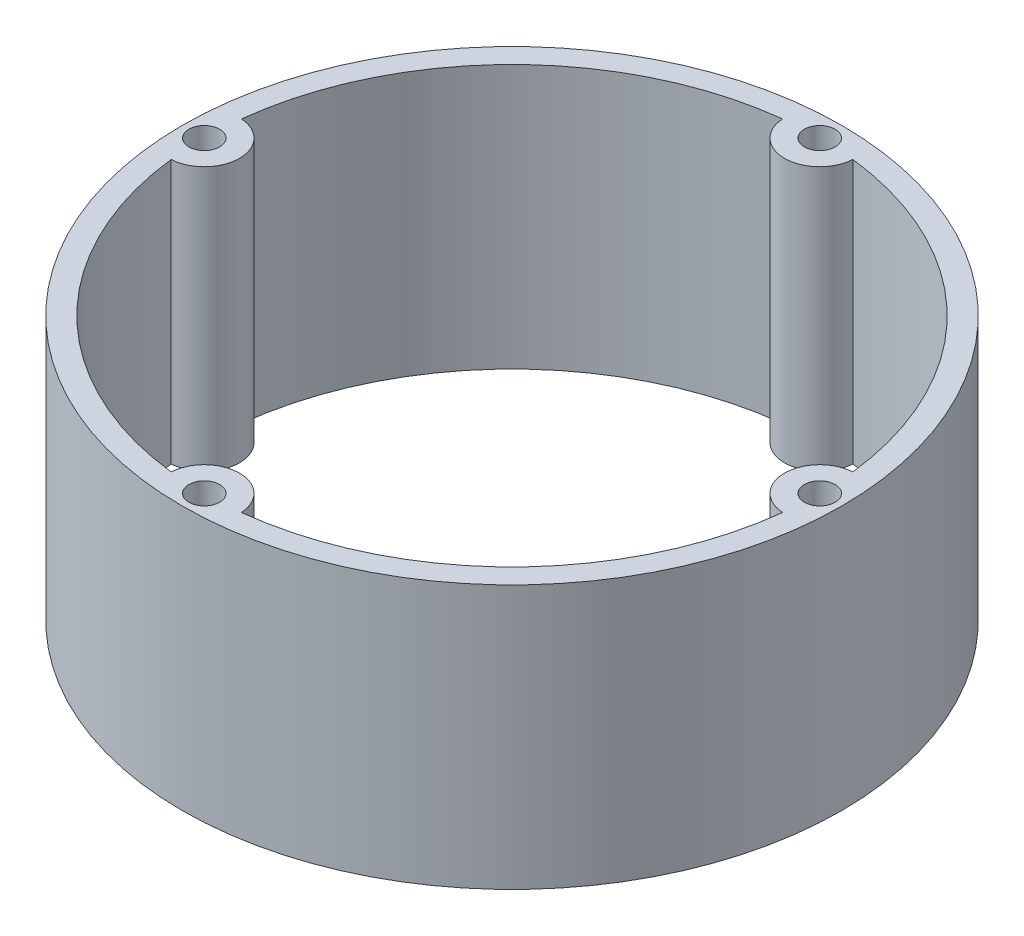
ISO-10303-21;
HEADER;
FILE_DESCRIPTION(('STEP AP214'),'2;1');
FILE_NAME('part.step','',(''),(''),'','','');
FILE_SCHEMA(('AUTOMOTIVE_DESIGN { 1 0 10303 214 1 1 1 1 }'));
ENDSEC;
DATA;
#1=APPLICATION_CONTEXT('core data for automotive mechanical design processes');
#2=APPLICATION_PROTOCOL_DEFINITION('international standard','automotive_design',2000,#1);
#3=PRODUCT_CONTEXT('',#1,'mechanical');
#4=PRODUCT('Part','Part','',(#3));
#5=PRODUCT_RELATED_PRODUCT_CATEGORY('part','',(#4));
#6=PRODUCT_DEFINITION_FORMATION('','',#4);
#7=PRODUCT_DEFINITION_CONTEXT('part definition',#1,'design');
#8=PRODUCT_DEFINITION('design','',#6,#7);
#9=PRODUCT_DEFINITION_SHAPE('','',#8);
#10=(LENGTH_UNIT() NAMED_UNIT(*) SI_UNIT(.MILLI.,.METRE.));
#11=(NAMED_UNIT(*) PLANE_ANGLE_UNIT() SI_UNIT($,.RADIAN.));
#12=(NAMED_UNIT(*) SI_UNIT($,.STERADIAN.) SOLID_ANGLE_UNIT());
#13=UNCERTAINTY_MEASURE_WITH_UNIT(LENGTH_MEASURE(1.E-05),#10,'distance_accuracy_value','');
#14=(GEOMETRIC_REPRESENTATION_CONTEXT(3) GLOBAL_UNCERTAINTY_ASSIGNED_CONTEXT((#13)) GLOBAL_UNIT_ASSIGNED_CONTEXT((#10,
#11,#12)) REPRESENTATION_CONTEXT('',''));
#15=CARTESIAN_POINT('',(0.,0.,0.));
#16=DIRECTION('',(0.,0.,1.));
#17=DIRECTION('',(1.,0.,0.));
#18=AXIS2_PLACEMENT_3D('',#15,#16,#17);
#19=CARTESIAN_POINT('',(0.,30.,0.));
#20=DIRECTION('',(0.,1.,0.));
#21=DIRECTION('',(0.,0.,1.));
#22=AXIS2_PLACEMENT_3D('',#19,#20,#21);
#23=PLANE('',#22);
#24=CARTESIAN_POINT('',(1.97666086873724E-12,30.,35.0000000000022));
#25=DIRECTION('',(0.,1.,0.));
#26=DIRECTION('',(0.,0.,1.));
#27=AXIS2_PLACEMENT_3D('',#24,#25,#26);
#28=CIRCLE('',#27,1.75000000000148);
#29=CARTESIAN_POINT('',(1.97666086873724E-12,30.,36.7500000000037));
#30=VERTEX_POINT('',#29);
#31=EDGE_CURVE('E193',#30,#30,#28,.T.);
#32=ORIENTED_EDGE('',*,*,#31,.F.);
#33=EDGE_LOOP('',(#32));
#34=FACE_BOUND('',#33,.T.);
#35=CARTESIAN_POINT('',(0.,30.,0.));
#36=DIRECTION('',(0.,1.,0.));
#37=DIRECTION('',(0.,0.,1.));
#38=AXIS2_PLACEMENT_3D('',#35,#36,#37);
#39=CIRCLE('',#38,35.);
#40=CARTESIAN_POINT('',(-34.7714285714283,30.,3.99346404792343));
#41=VERTEX_POINT('',#40);
#42=CARTESIAN_POINT('',(-3.99346404791928,30.,34.7714285714288));
#43=VERTEX_POINT('',#42);
#44=EDGE_CURVE('E106',#41,#43,#39,.T.);
#45=ORIENTED_EDGE('',*,*,#44,.F.);
#46=CARTESIAN_POINT('',(-35.0000000000001,30.,2.08896193498298E-12));
#47=DIRECTION('',(0.,-1.,0.));
#48=DIRECTION('',(0.,0.,1.));
#49=AXIS2_PLACEMENT_3D('',#46,#47,#48);
#50=CIRCLE('',#49,3.99999999999996);
#51=CARTESIAN_POINT('',(-34.7714285714288,30.,-3.99346404791928));
#52=VERTEX_POINT('',#51);
#53=EDGE_CURVE('E98',#52,#41,#50,.T.);
#54=ORIENTED_EDGE('',*,*,#53,.F.);
#55=CARTESIAN_POINT('',(0.,30.,0.));
#56=DIRECTION('',(0.,1.,0.));
#57=DIRECTION('',(0.,0.,1.));
#58=AXIS2_PLACEMENT_3D('',#55,#56,#57);
#59=CIRCLE('',#58,35.);
#60=CARTESIAN_POINT('',(-3.99346404792344,30.,-34.7714285714283));
#61=VERTEX_POINT('',#60);
#62=EDGE_CURVE('E133',#61,#52,#59,.T.);
#63=ORIENTED_EDGE('',*,*,#62,.F.);
#64=CARTESIAN_POINT('',(-2.09110506688148E-12,30.,-35.0000000000001));
#65=DIRECTION('',(0.,-1.,0.));
#66=DIRECTION('',(0.,0.,1.));
#67=AXIS2_PLACEMENT_3D('',#64,#65,#66);
#68=CIRCLE('',#67,3.99999999999996);
#69=CARTESIAN_POINT('',(3.99346404791929,30.,-34.7714285714288));
#70=VERTEX_POINT('',#69);
#71=EDGE_CURVE('E131',#70,#61,#68,.T.);
#72=ORIENTED_EDGE('',*,*,#71,.F.);
#73=CARTESIAN_POINT('',(0.,30.,0.));
#74=DIRECTION('',(0.,1.,0.));
#75=DIRECTION('',(0.,0.,1.));
#76=AXIS2_PLACEMENT_3D('',#73,#74,#75);
#77=CIRCLE('',#76,35.);
#78=CARTESIAN_POINT('',(34.7714285714283,30.,-3.99346404792344));
#79=VERTEX_POINT('',#78);
#80=EDGE_CURVE('E129',#79,#70,#77,.T.);
#81=ORIENTED_EDGE('',*,*,#80,.F.);
#82=CARTESIAN_POINT('',(35.0000000000001,30.,-2.09324819877999E-12));
#83=DIRECTION('',(0.,-1.,0.));
#84=DIRECTION('',(0.,0.,1.));
#85=AXIS2_PLACEMENT_3D('',#82,#83,#84);
#86=CIRCLE('',#85,3.99999999999996);
#87=CARTESIAN_POINT('',(34.7714285714288,30.,3.99346404791928));
#88=VERTEX_POINT('',#87);
#89=EDGE_CURVE('E127',#88,#79,#86,.T.);
#90=ORIENTED_EDGE('',*,*,#89,.F.);
#91=CARTESIAN_POINT('',(0.,30.,0.));
#92=DIRECTION('',(0.,1.,0.));
#93=DIRECTION('',(0.,0.,1.));
#94=AXIS2_PLACEMENT_3D('',#91,#92,#93);
#95=CIRCLE('',#94,35.);
#96=CARTESIAN_POINT('',(3.99346404792345,30.,34.7714285714283));
#97=VERTEX_POINT('',#96);
#98=EDGE_CURVE('E122',#97,#88,#95,.T.);
#99=ORIENTED_EDGE('',*,*,#98,.F.);
#100=CARTESIAN_POINT('',(2.0953913306785E-12,30.,35.0000000000001));
#101=DIRECTION('',(0.,-1.,0.));
#102=DIRECTION('',(0.,0.,1.));
#103=AXIS2_PLACEMENT_3D('',#100,#101,#102);
#104=CIRCLE('',#103,3.99999999999996);
#105=EDGE_CURVE('E120',#43,#97,#104,.T.);
#106=ORIENTED_EDGE('',*,*,#105,.F.);
#107=EDGE_LOOP('',(#45,#54,#63,#72,#81,#90,#99,#106));
#108=FACE_BOUND('',#107,.T.);
#109=CARTESIAN_POINT('',(0.,30.,-35.));
#110=DIRECTION('',(0.,1.,0.));
#111=DIRECTION('',(0.,0.,1.));
#112=AXIS2_PLACEMENT_3D('',#109,#110,#111);
#113=CIRCLE('',#112,1.75);
#114=CARTESIAN_POINT('',(0.,30.,-33.25));
#115=VERTEX_POINT('',#114);
#116=EDGE_CURVE('E166',#115,#115,#113,.T.);
#117=ORIENTED_EDGE('',*,*,#116,.F.);
#118=EDGE_LOOP('',(#117));
#119=FACE_BOUND('',#118,.T.);
#120=CARTESIAN_POINT('',(0.,30.,0.));
#121=DIRECTION('',(0.,1.,0.));
#122=DIRECTION('',(0.,0.,1.));
#123=AXIS2_PLACEMENT_3D('',#120,#121,#122);
#124=CIRCLE('',#123,37.5);
#125=CARTESIAN_POINT('',(0.,30.,37.5));
#126=VERTEX_POINT('',#125);
#127=EDGE_CURVE('E11',#126,#126,#124,.T.);
#128=ORIENTED_EDGE('',*,*,#127,.T.);
#129=EDGE_LOOP('',(#128));
#130=FACE_BOUND('',#129,.T.);
#131=CARTESIAN_POINT('',(35.0000000000021,30.,1.08014802448722E-13));
#132=DIRECTION('',(0.,1.,0.));
#133=DIRECTION('',(0.,0.,1.));
#134=AXIS2_PLACEMENT_3D('',#131,#132,#133);
#135=CIRCLE('',#134,1.7499999999994);
#136=CARTESIAN_POINT('',(35.0000000000021,30.,1.74999999999951));
#137=VERTEX_POINT('',#136);
#138=EDGE_CURVE('E136',#137,#137,#135,.T.);
#139=ORIENTED_EDGE('',*,*,#138,.F.);
#140=EDGE_LOOP('',(#139));
#141=FACE_BOUND('',#140,.T.);
#142=CARTESIAN_POINT('',(-35.0000000000001,30.,2.08896193498298E-12));
#143=DIRECTION('',(0.,1.,0.));
#144=DIRECTION('',(0.,0.,1.));
#145=AXIS2_PLACEMENT_3D('',#142,#143,#144);
#146=CIRCLE('',#145,1.75000000000232);
#147=CARTESIAN_POINT('',(-35.0000000000001,30.,1.75000000000441));
#148=VERTEX_POINT('',#147);
#149=EDGE_CURVE('E200',#148,#148,#146,.T.);
#150=ORIENTED_EDGE('',*,*,#149,.F.);
#151=EDGE_LOOP('',(#150));
#152=FACE_BOUND('',#151,.T.);
#153=ADVANCED_FACE('F33',(#34,#108,#119,#130,#141,#152),#23,.T.);
#154=CARTESIAN_POINT('',(0.,0.,0.));
#155=DIRECTION('',(0.,1.,0.));
#156=DIRECTION('',(0.,0.,1.));
#157=AXIS2_PLACEMENT_3D('',#154,#155,#156);
#158=PLANE('',#157);
#159=CARTESIAN_POINT('',(0.,0.,-35.));
#160=DIRECTION('',(0.,1.,0.));
#161=DIRECTION('',(0.,0.,1.));
#162=AXIS2_PLACEMENT_3D('',#159,#160,#161);
#163=CIRCLE('',#162,1.75);
#164=CARTESIAN_POINT('',(0.,0.,-33.25));
#165=VERTEX_POINT('',#164);
#166=EDGE_CURVE('E114',#165,#165,#163,.T.);
#167=ORIENTED_EDGE('',*,*,#166,.T.);
#168=EDGE_LOOP('',(#167));
#169=FACE_BOUND('',#168,.T.);
#170=CARTESIAN_POINT('',(0.,0.,0.));
#171=DIRECTION('',(0.,1.,0.));
#172=DIRECTION('',(0.,0.,1.));
#173=AXIS2_PLACEMENT_3D('',#170,#171,#172);
#174=CIRCLE('',#173,37.5);
#175=CARTESIAN_POINT('',(0.,0.,37.5));
#176=VERTEX_POINT('',#175);
#177=EDGE_CURVE('E37',#176,#176,#174,.T.);
#178=ORIENTED_EDGE('',*,*,#177,.F.);
#179=EDGE_LOOP('',(#178));
#180=FACE_BOUND('',#179,.T.);
#181=CARTESIAN_POINT('',(-35.0000000000001,0.,2.08896193498298E-12));
#182=DIRECTION('',(0.,-1.,0.));
#183=DIRECTION('',(0.,0.,1.));
#184=AXIS2_PLACEMENT_3D('',#181,#182,#183);
#185=CIRCLE('',#184,3.99999999999996);
#186=CARTESIAN_POINT('',(-34.7714285714288,0.,-3.99346404791928));
#187=VERTEX_POINT('',#186);
#188=CARTESIAN_POINT('',(-34.7714285714283,0.,3.99346404792343));
#189=VERTEX_POINT('',#188);
#190=EDGE_CURVE('E56',#187,#189,#185,.T.);
#191=ORIENTED_EDGE('',*,*,#190,.T.);
#192=CARTESIAN_POINT('',(0.,0.,0.));
#193=DIRECTION('',(0.,1.,0.));
#194=DIRECTION('',(0.,0.,1.));
#195=AXIS2_PLACEMENT_3D('',#192,#193,#194);
#196=CIRCLE('',#195,35.);
#197=CARTESIAN_POINT('',(-3.99346404791928,0.,34.7714285714288));
#198=VERTEX_POINT('',#197);
#199=EDGE_CURVE('E113',#189,#198,#196,.T.);
#200=ORIENTED_EDGE('',*,*,#199,.T.);
#201=CARTESIAN_POINT('',(2.0953913306785E-12,0.,35.0000000000001));
#202=DIRECTION('',(0.,-1.,0.));
#203=DIRECTION('',(0.,0.,1.));
#204=AXIS2_PLACEMENT_3D('',#201,#202,#203);
#205=CIRCLE('',#204,3.99999999999996);
#206=CARTESIAN_POINT('',(3.99346404792345,0.,34.7714285714283));
#207=VERTEX_POINT('',#206);
#208=EDGE_CURVE('E138',#198,#207,#205,.T.);
#209=ORIENTED_EDGE('',*,*,#208,.T.);
#210=CARTESIAN_POINT('',(0.,0.,0.));
#211=DIRECTION('',(0.,1.,0.));
#212=DIRECTION('',(0.,0.,1.));
#213=AXIS2_PLACEMENT_3D('',#210,#211,#212);
#214=CIRCLE('',#213,35.);
#215=CARTESIAN_POINT('',(34.7714285714288,0.,3.99346404791928));
#216=VERTEX_POINT('',#215);
#217=EDGE_CURVE('E141',#207,#216,#214,.T.);
#218=ORIENTED_EDGE('',*,*,#217,.T.);
#219=CARTESIAN_POINT('',(35.0000000000001,0.,-2.09324819877999E-12));
#220=DIRECTION('',(0.,-1.,0.));
#221=DIRECTION('',(0.,0.,1.));
#222=AXIS2_PLACEMENT_3D('',#219,#220,#221);
#223=CIRCLE('',#222,3.99999999999996);
#224=CARTESIAN_POINT('',(34.7714285714283,0.,-3.99346404792344));
#225=VERTEX_POINT('',#224);
#226=EDGE_CURVE('E144',#216,#225,#223,.T.);
#227=ORIENTED_EDGE('',*,*,#226,.T.);
#228=CARTESIAN_POINT('',(0.,0.,0.));
#229=DIRECTION('',(0.,1.,0.));
#230=DIRECTION('',(0.,0.,1.));
#231=AXIS2_PLACEMENT_3D('',#228,#229,#230);
#232=CIRCLE('',#231,35.);
#233=CARTESIAN_POINT('',(3.99346404791929,0.,-34.7714285714288));
#234=VERTEX_POINT('',#233);
#235=EDGE_CURVE('E147',#225,#234,#232,.T.);
#236=ORIENTED_EDGE('',*,*,#235,.T.);
#237=CARTESIAN_POINT('',(-2.09110506688148E-12,0.,-35.0000000000001));
#238=DIRECTION('',(0.,-1.,0.));
#239=DIRECTION('',(0.,0.,1.));
#240=AXIS2_PLACEMENT_3D('',#237,#238,#239);
#241=CIRCLE('',#240,3.99999999999996);
#242=CARTESIAN_POINT('',(-3.99346404792344,0.,-34.7714285714283));
#243=VERTEX_POINT('',#242);
#244=EDGE_CURVE('E150',#234,#243,#241,.T.);
#245=ORIENTED_EDGE('',*,*,#244,.T.);
#246=CARTESIAN_POINT('',(0.,0.,0.));
#247=DIRECTION('',(0.,1.,0.));
#248=DIRECTION('',(0.,0.,1.));
#249=AXIS2_PLACEMENT_3D('',#246,#247,#248);
#250=CIRCLE('',#249,35.);
#251=EDGE_CURVE('E107',#243,#187,#250,.T.);
#252=ORIENTED_EDGE('',*,*,#251,.T.);
#253=EDGE_LOOP('',(#191,#200,#209,#218,#227,#236,#245,#252));
#254=FACE_BOUND('',#253,.T.);
#255=CARTESIAN_POINT('',(35.0000000000021,0.,1.08014802448722E-13));
#256=DIRECTION('',(0.,1.,0.));
#257=DIRECTION('',(0.,0.,1.));
#258=AXIS2_PLACEMENT_3D('',#255,#256,#257);
#259=CIRCLE('',#258,1.7499999999994);
#260=CARTESIAN_POINT('',(35.0000000000021,0.,1.74999999999951));
#261=VERTEX_POINT('',#260);
#262=EDGE_CURVE('E195',#261,#261,#259,.T.);
#263=ORIENTED_EDGE('',*,*,#262,.T.);
#264=EDGE_LOOP('',(#263));
#265=FACE_BOUND('',#264,.T.);
#266=CARTESIAN_POINT('',(1.97666086873724E-12,0.,35.0000000000022));
#267=DIRECTION('',(0.,1.,0.));
#268=DIRECTION('',(0.,0.,1.));
#269=AXIS2_PLACEMENT_3D('',#266,#267,#268);
#270=CIRCLE('',#269,1.75000000000148);
#271=CARTESIAN_POINT('',(1.97666086873724E-12,0.,36.7500000000037));
#272=VERTEX_POINT('',#271);
#273=EDGE_CURVE('E196',#272,#272,#270,.T.);
#274=ORIENTED_EDGE('',*,*,#273,.T.);
#275=EDGE_LOOP('',(#274));
#276=FACE_BOUND('',#275,.T.);
#277=CARTESIAN_POINT('',(-35.0000000000001,0.,2.08896193498298E-12));
#278=DIRECTION('',(0.,1.,0.));
#279=DIRECTION('',(0.,0.,1.));
#280=AXIS2_PLACEMENT_3D('',#277,#278,#279);
#281=CIRCLE('',#280,1.75000000000232);
#282=CARTESIAN_POINT('',(-35.0000000000001,0.,1.75000000000441));
#283=VERTEX_POINT('',#282);
#284=EDGE_CURVE('E203',#283,#283,#281,.T.);
#285=ORIENTED_EDGE('',*,*,#284,.T.);
#286=EDGE_LOOP('',(#285));
#287=FACE_BOUND('',#286,.T.);
#288=ADVANCED_FACE('F172',(#169,#180,#254,#265,#276,#287),#158,.F.);
#289=CARTESIAN_POINT('',(0.,30.,0.));
#290=DIRECTION('',(0.,-1.,0.));
#291=DIRECTION('',(0.,0.,-1.));
#292=AXIS2_PLACEMENT_3D('',#289,#290,#291);
#293=CYLINDRICAL_SURFACE('',#292,37.5);
#294=ORIENTED_EDGE('',*,*,#127,.F.);
#295=EDGE_LOOP('',(#294));
#296=FACE_BOUND('',#295,.T.);
#297=ORIENTED_EDGE('',*,*,#177,.T.);
#298=EDGE_LOOP('',(#297));
#299=FACE_BOUND('',#298,.T.);
#300=ADVANCED_FACE('F35',(#296,#299),#293,.T.);
#301=CARTESIAN_POINT('',(0.,30.,-35.));
#302=DIRECTION('',(0.,-1.,0.));
#303=DIRECTION('',(0.,0.,-1.));
#304=AXIS2_PLACEMENT_3D('',#301,#302,#303);
#305=CYLINDRICAL_SURFACE('',#304,1.75);
#306=ORIENTED_EDGE('',*,*,#116,.T.);
#307=EDGE_LOOP('',(#306));
#308=FACE_BOUND('',#307,.T.);
#309=ORIENTED_EDGE('',*,*,#166,.F.);
#310=EDGE_LOOP('',(#309));
#311=FACE_BOUND('',#310,.T.);
#312=ADVANCED_FACE('F175',(#308,#311),#305,.F.);
#313=CARTESIAN_POINT('',(-35.0000000000001,30.,2.08896193498298E-12));
#314=DIRECTION('',(0.,-1.,0.));
#315=DIRECTION('',(0.,0.,-1.));
#316=AXIS2_PLACEMENT_3D('',#313,#314,#315);
#317=CYLINDRICAL_SURFACE('',#316,3.99999999999996);
#318=ORIENTED_EDGE('',*,*,#190,.F.);
#319=DIRECTION('',(0.,-1.,0.));
#320=VECTOR('',#319,1.);
#321=CARTESIAN_POINT('',(-34.7714285714288,30.,-3.99346404791928));
#322=LINE('',#321,#320);
#323=EDGE_CURVE('E102',#52,#187,#322,.T.);
#324=ORIENTED_EDGE('',*,*,#323,.F.);
#325=ORIENTED_EDGE('',*,*,#53,.T.);
#326=DIRECTION('',(0.,-1.,0.));
#327=VECTOR('',#326,1.);
#328=CARTESIAN_POINT('',(-34.7714285714283,30.,3.99346404792343));
#329=LINE('',#328,#327);
#330=EDGE_CURVE('E101',#41,#189,#329,.T.);
#331=ORIENTED_EDGE('',*,*,#330,.T.);
#332=EDGE_LOOP('',(#318,#324,#325,#331));
#333=FACE_BOUND('',#332,.T.);
#334=ADVANCED_FACE('F100',(#333),#317,.T.);
#335=CARTESIAN_POINT('',(0.,30.,0.));
#336=DIRECTION('',(0.,-1.,0.));
#337=DIRECTION('',(0.,0.,-1.));
#338=AXIS2_PLACEMENT_3D('',#335,#336,#337);
#339=CYLINDRICAL_SURFACE('',#338,35.);
#340=ORIENTED_EDGE('',*,*,#199,.F.);
#341=ORIENTED_EDGE('',*,*,#330,.F.);
#342=ORIENTED_EDGE('',*,*,#44,.T.);
#343=DIRECTION('',(0.,-1.,0.));
#344=VECTOR('',#343,1.);
#345=CARTESIAN_POINT('',(-3.99346404791928,30.,34.7714285714288));
#346=LINE('',#345,#344);
#347=EDGE_CURVE('E115',#43,#198,#346,.T.);
#348=ORIENTED_EDGE('',*,*,#347,.T.);
#349=EDGE_LOOP('',(#340,#341,#342,#348));
#350=FACE_BOUND('',#349,.T.);
#351=ADVANCED_FACE('F110',(#350),#339,.F.);
#352=CARTESIAN_POINT('',(2.0953913306785E-12,30.,35.0000000000001));
#353=DIRECTION('',(0.,-1.,0.));
#354=DIRECTION('',(0.,0.,-1.));
#355=AXIS2_PLACEMENT_3D('',#352,#353,#354);
#356=CYLINDRICAL_SURFACE('',#355,3.99999999999996);
#357=ORIENTED_EDGE('',*,*,#208,.F.);
#358=ORIENTED_EDGE('',*,*,#347,.F.);
#359=ORIENTED_EDGE('',*,*,#105,.T.);
#360=DIRECTION('',(0.,-1.,0.));
#361=VECTOR('',#360,1.);
#362=CARTESIAN_POINT('',(3.99346404792345,30.,34.7714285714283));
#363=LINE('',#362,#361);
#364=EDGE_CURVE('E163',#97,#207,#363,.T.);
#365=ORIENTED_EDGE('',*,*,#364,.T.);
#366=EDGE_LOOP('',(#357,#358,#359,#365));
#367=FACE_BOUND('',#366,.T.);
#368=ADVANCED_FACE('F249',(#367),#356,.T.);
#369=CARTESIAN_POINT('',(0.,30.,0.));
#370=DIRECTION('',(0.,-1.,0.));
#371=DIRECTION('',(0.,0.,-1.));
#372=AXIS2_PLACEMENT_3D('',#369,#370,#371);
#373=CYLINDRICAL_SURFACE('',#372,35.);
#374=ORIENTED_EDGE('',*,*,#217,.F.);
#375=ORIENTED_EDGE('',*,*,#364,.F.);
#376=ORIENTED_EDGE('',*,*,#98,.T.);
#377=DIRECTION('',(0.,-1.,0.));
#378=VECTOR('',#377,1.);
#379=CARTESIAN_POINT('',(34.7714285714288,30.,3.99346404791928));
#380=LINE('',#379,#378);
#381=EDGE_CURVE('E161',#88,#216,#380,.T.);
#382=ORIENTED_EDGE('',*,*,#381,.T.);
#383=EDGE_LOOP('',(#374,#375,#376,#382));
#384=FACE_BOUND('',#383,.T.);
#385=ADVANCED_FACE('F245',(#384),#373,.F.);
#386=CARTESIAN_POINT('',(35.0000000000001,30.,-2.09324819877999E-12));
#387=DIRECTION('',(0.,-1.,0.));
#388=DIRECTION('',(0.,0.,-1.));
#389=AXIS2_PLACEMENT_3D('',#386,#387,#388);
#390=CYLINDRICAL_SURFACE('',#389,3.99999999999996);
#391=ORIENTED_EDGE('',*,*,#226,.F.);
#392=ORIENTED_EDGE('',*,*,#381,.F.);
#393=ORIENTED_EDGE('',*,*,#89,.T.);
#394=DIRECTION('',(0.,-1.,0.));
#395=VECTOR('',#394,1.);
#396=CARTESIAN_POINT('',(34.7714285714283,30.,-3.99346404792344));
#397=LINE('',#396,#395);
#398=EDGE_CURVE('E159',#79,#225,#397,.T.);
#399=ORIENTED_EDGE('',*,*,#398,.T.);
#400=EDGE_LOOP('',(#391,#392,#393,#399));
#401=FACE_BOUND('',#400,.T.);
#402=ADVANCED_FACE('F241',(#401),#390,.T.);
#403=CARTESIAN_POINT('',(0.,30.,0.));
#404=DIRECTION('',(0.,-1.,0.));
#405=DIRECTION('',(0.,0.,-1.));
#406=AXIS2_PLACEMENT_3D('',#403,#404,#405);
#407=CYLINDRICAL_SURFACE('',#406,35.);
#408=ORIENTED_EDGE('',*,*,#235,.F.);
#409=ORIENTED_EDGE('',*,*,#398,.F.);
#410=ORIENTED_EDGE('',*,*,#80,.T.);
#411=DIRECTION('',(0.,-1.,0.));
#412=VECTOR('',#411,1.);
#413=CARTESIAN_POINT('',(3.99346404791929,30.,-34.7714285714288));
#414=LINE('',#413,#412);
#415=EDGE_CURVE('E157',#70,#234,#414,.T.);
#416=ORIENTED_EDGE('',*,*,#415,.T.);
#417=EDGE_LOOP('',(#408,#409,#410,#416));
#418=FACE_BOUND('',#417,.T.);
#419=ADVANCED_FACE('F237',(#418),#407,.F.);
#420=CARTESIAN_POINT('',(-2.09110506688148E-12,30.,-35.0000000000001));
#421=DIRECTION('',(0.,-1.,0.));
#422=DIRECTION('',(0.,0.,-1.));
#423=AXIS2_PLACEMENT_3D('',#420,#421,#422);
#424=CYLINDRICAL_SURFACE('',#423,3.99999999999996);
#425=ORIENTED_EDGE('',*,*,#244,.F.);
#426=ORIENTED_EDGE('',*,*,#415,.F.);
#427=ORIENTED_EDGE('',*,*,#71,.T.);
#428=DIRECTION('',(0.,-1.,0.));
#429=VECTOR('',#428,1.);
#430=CARTESIAN_POINT('',(-3.99346404792344,30.,-34.7714285714283));
#431=LINE('',#430,#429);
#432=EDGE_CURVE('E48',#61,#243,#431,.T.);
#433=ORIENTED_EDGE('',*,*,#432,.T.);
#434=EDGE_LOOP('',(#425,#426,#427,#433));
#435=FACE_BOUND('',#434,.T.);
#436=ADVANCED_FACE('F234',(#435),#424,.T.);
#437=CARTESIAN_POINT('',(0.,30.,0.));
#438=DIRECTION('',(0.,-1.,0.));
#439=DIRECTION('',(0.,0.,-1.));
#440=AXIS2_PLACEMENT_3D('',#437,#438,#439);
#441=CYLINDRICAL_SURFACE('',#440,35.);
#442=ORIENTED_EDGE('',*,*,#251,.F.);
#443=ORIENTED_EDGE('',*,*,#432,.F.);
#444=ORIENTED_EDGE('',*,*,#62,.T.);
#445=ORIENTED_EDGE('',*,*,#323,.T.);
#446=EDGE_LOOP('',(#442,#443,#444,#445));
#447=FACE_BOUND('',#446,.T.);
#448=ADVANCED_FACE('F231',(#447),#441,.F.);
#449=CARTESIAN_POINT('',(35.0000000000021,30.,1.08014802448722E-13));
#450=DIRECTION('',(0.,-1.,0.));
#451=DIRECTION('',(0.,0.,-1.));
#452=AXIS2_PLACEMENT_3D('',#449,#450,#451);
#453=CYLINDRICAL_SURFACE('',#452,1.7499999999994);
#454=ORIENTED_EDGE('',*,*,#138,.T.);
#455=EDGE_LOOP('',(#454));
#456=FACE_BOUND('',#455,.T.);
#457=ORIENTED_EDGE('',*,*,#262,.F.);
#458=EDGE_LOOP('',(#457));
#459=FACE_BOUND('',#458,.T.);
#460=ADVANCED_FACE('F209',(#456,#459),#453,.F.);
#461=CARTESIAN_POINT('',(1.97666086873724E-12,30.,35.0000000000022));
#462=DIRECTION('',(0.,-1.,0.));
#463=DIRECTION('',(0.,0.,-1.));
#464=AXIS2_PLACEMENT_3D('',#461,#462,#463);
#465=CYLINDRICAL_SURFACE('',#464,1.75000000000148);
#466=ORIENTED_EDGE('',*,*,#31,.T.);
#467=EDGE_LOOP('',(#466));
#468=FACE_BOUND('',#467,.T.);
#469=ORIENTED_EDGE('',*,*,#273,.F.);
#470=EDGE_LOOP('',(#469));
#471=FACE_BOUND('',#470,.T.);
#472=ADVANCED_FACE('F222',(#468,#471),#465,.F.);
#473=CARTESIAN_POINT('',(-35.0000000000001,30.,2.08896193498298E-12));
#474=DIRECTION('',(0.,-1.,0.));
#475=DIRECTION('',(0.,0.,-1.));
#476=AXIS2_PLACEMENT_3D('',#473,#474,#475);
#477=CYLINDRICAL_SURFACE('',#476,1.75000000000232);
#478=ORIENTED_EDGE('',*,*,#149,.T.);
#479=EDGE_LOOP('',(#478));
#480=FACE_BOUND('',#479,.T.);
#481=ORIENTED_EDGE('',*,*,#284,.F.);
#482=EDGE_LOOP('',(#481));
#483=FACE_BOUND('',#482,.T.);
#484=ADVANCED_FACE('F220',(#480,#483),#477,.F.);
#485=CLOSED_SHELL('',(#153,#288,#300,#312,#334,#351,#368,#385,#402,#419,#436,#448,#460,#472,#484));
#486=MANIFOLD_SOLID_BREP('B2',#485);
#487=ADVANCED_BREP_SHAPE_REPRESENTATION('',(#18,#486),#14);
#488=SHAPE_DEFINITION_REPRESENTATION(#9,#487);
ENDSEC;
END-ISO-10303-21;
